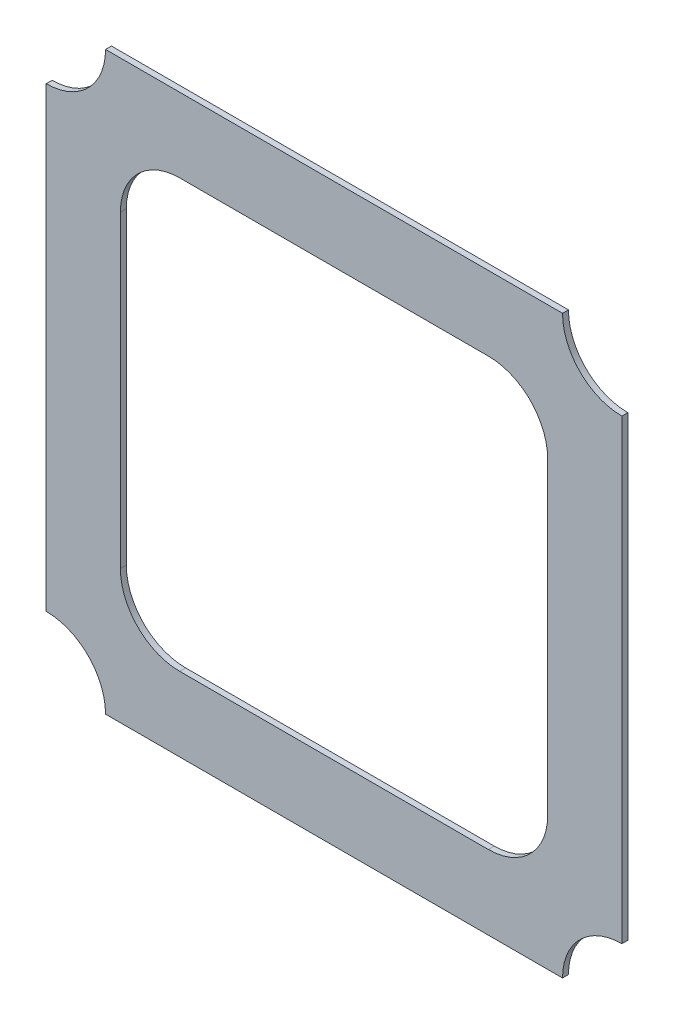
ISO-10303-21;
HEADER;
FILE_DESCRIPTION(('STEP AP214'),'2;1');
FILE_NAME('part.step','',(''),(''),'','','');
FILE_SCHEMA(('AUTOMOTIVE_DESIGN { 1 0 10303 214 1 1 1 1 }'));
ENDSEC;
DATA;
#1=APPLICATION_CONTEXT('core data for automotive mechanical design processes');
#2=APPLICATION_PROTOCOL_DEFINITION('international standard','automotive_design',2000,#1);
#3=PRODUCT_CONTEXT('',#1,'mechanical');
#4=PRODUCT('Part','Part','',(#3));
#5=PRODUCT_RELATED_PRODUCT_CATEGORY('part','',(#4));
#6=PRODUCT_DEFINITION_FORMATION('','',#4);
#7=PRODUCT_DEFINITION_CONTEXT('part definition',#1,'design');
#8=PRODUCT_DEFINITION('design','',#6,#7);
#9=PRODUCT_DEFINITION_SHAPE('','',#8);
#10=(LENGTH_UNIT() NAMED_UNIT(*) SI_UNIT(.MILLI.,.METRE.));
#11=(NAMED_UNIT(*) PLANE_ANGLE_UNIT() SI_UNIT($,.RADIAN.));
#12=(NAMED_UNIT(*) SI_UNIT($,.STERADIAN.) SOLID_ANGLE_UNIT());
#13=UNCERTAINTY_MEASURE_WITH_UNIT(LENGTH_MEASURE(1.E-05),#10,'distance_accuracy_value','');
#14=(GEOMETRIC_REPRESENTATION_CONTEXT(3) GLOBAL_UNCERTAINTY_ASSIGNED_CONTEXT((#13)) GLOBAL_UNIT_ASSIGNED_CONTEXT((#10,
#11,#12)) REPRESENTATION_CONTEXT('',''));
#15=CARTESIAN_POINT('',(0.,0.,0.));
#16=DIRECTION('',(0.,0.,1.));
#17=DIRECTION('',(1.,0.,0.));
#18=AXIS2_PLACEMENT_3D('',#15,#16,#17);
#19=CARTESIAN_POINT('',(48.5,0.,1.));
#20=DIRECTION('',(1.,0.,0.));
#21=DIRECTION('',(0.,1.,0.));
#22=AXIS2_PLACEMENT_3D('',#19,#20,#21);
#23=PLANE('',#22);
#24=DIRECTION('',(0.,0.,1.));
#25=VECTOR('',#24,1.);
#26=CARTESIAN_POINT('',(48.5,-38.5,0.));
#27=LINE('',#26,#25);
#28=CARTESIAN_POINT('',(48.5,-38.5,0.));
#29=VERTEX_POINT('',#28);
#30=CARTESIAN_POINT('',(48.5,-38.5,1.));
#31=VERTEX_POINT('',#30);
#32=EDGE_CURVE('E427',#29,#31,#27,.T.);
#33=ORIENTED_EDGE('',*,*,#32,.F.);
#34=DIRECTION('',(0.,-1.,0.));
#35=VECTOR('',#34,1.);
#36=CARTESIAN_POINT('',(48.5,0.,0.));
#37=LINE('',#36,#35);
#38=CARTESIAN_POINT('',(48.5,38.5,0.));
#39=VERTEX_POINT('',#38);
#40=EDGE_CURVE('E168',#39,#29,#37,.T.);
#41=ORIENTED_EDGE('',*,*,#40,.F.);
#42=DIRECTION('',(0.,0.,1.));
#43=VECTOR('',#42,1.);
#44=CARTESIAN_POINT('',(48.5,38.5,0.));
#45=LINE('',#44,#43);
#46=CARTESIAN_POINT('',(48.5,38.5,1.));
#47=VERTEX_POINT('',#46);
#48=EDGE_CURVE('E153',#39,#47,#45,.T.);
#49=ORIENTED_EDGE('',*,*,#48,.T.);
#50=DIRECTION('',(0.,-1.,0.));
#51=VECTOR('',#50,1.);
#52=CARTESIAN_POINT('',(48.5,0.,1.));
#53=LINE('',#52,#51);
#54=EDGE_CURVE('E165',#47,#31,#53,.T.);
#55=ORIENTED_EDGE('',*,*,#54,.T.);
#56=EDGE_LOOP('',(#33,#41,#49,#55));
#57=FACE_BOUND('',#56,.T.);
#58=ADVANCED_FACE('F36',(#57),#23,.T.);
#59=CARTESIAN_POINT('',(0.,48.5,1.));
#60=DIRECTION('',(0.,1.,0.));
#61=DIRECTION('',(0.,0.,1.));
#62=AXIS2_PLACEMENT_3D('',#59,#60,#61);
#63=PLANE('',#62);
#64=DIRECTION('',(0.,0.,1.));
#65=VECTOR('',#64,1.);
#66=CARTESIAN_POINT('',(38.5,48.5,0.));
#67=LINE('',#66,#65);
#68=CARTESIAN_POINT('',(38.5,48.5,0.));
#69=VERTEX_POINT('',#68);
#70=CARTESIAN_POINT('',(38.5,48.5,1.));
#71=VERTEX_POINT('',#70);
#72=EDGE_CURVE('E154',#69,#71,#67,.T.);
#73=ORIENTED_EDGE('',*,*,#72,.F.);
#74=DIRECTION('',(1.,0.,0.));
#75=VECTOR('',#74,1.);
#76=CARTESIAN_POINT('',(0.,48.5,0.));
#77=LINE('',#76,#75);
#78=CARTESIAN_POINT('',(-38.5,48.5,0.));
#79=VERTEX_POINT('',#78);
#80=EDGE_CURVE('E202',#79,#69,#77,.T.);
#81=ORIENTED_EDGE('',*,*,#80,.F.);
#82=DIRECTION('',(0.,0.,1.));
#83=VECTOR('',#82,1.);
#84=CARTESIAN_POINT('',(-38.5,48.5,0.));
#85=LINE('',#84,#83);
#86=CARTESIAN_POINT('',(-38.5,48.5,1.));
#87=VERTEX_POINT('',#86);
#88=EDGE_CURVE('E169',#79,#87,#85,.T.);
#89=ORIENTED_EDGE('',*,*,#88,.T.);
#90=DIRECTION('',(1.,0.,0.));
#91=VECTOR('',#90,1.);
#92=CARTESIAN_POINT('',(0.,48.5,1.));
#93=LINE('',#92,#91);
#94=EDGE_CURVE('E175',#87,#71,#93,.T.);
#95=ORIENTED_EDGE('',*,*,#94,.T.);
#96=EDGE_LOOP('',(#73,#81,#89,#95));
#97=FACE_BOUND('',#96,.T.);
#98=ADVANCED_FACE('F305',(#97),#63,.T.);
#99=CARTESIAN_POINT('',(-48.5,0.,1.));
#100=DIRECTION('',(1.,0.,0.));
#101=DIRECTION('',(0.,0.,-1.));
#102=AXIS2_PLACEMENT_3D('',#99,#100,#101);
#103=PLANE('',#102);
#104=DIRECTION('',(0.,0.,1.));
#105=VECTOR('',#104,1.);
#106=CARTESIAN_POINT('',(-48.5,-38.5,0.));
#107=LINE('',#106,#105);
#108=CARTESIAN_POINT('',(-48.5,-38.5,0.));
#109=VERTEX_POINT('',#108);
#110=CARTESIAN_POINT('',(-48.5,-38.5,1.));
#111=VERTEX_POINT('',#110);
#112=EDGE_CURVE('E431',#109,#111,#107,.T.);
#113=ORIENTED_EDGE('',*,*,#112,.T.);
#114=DIRECTION('',(0.,-1.,0.));
#115=VECTOR('',#114,1.);
#116=CARTESIAN_POINT('',(-48.5,0.,1.));
#117=LINE('',#116,#115);
#118=CARTESIAN_POINT('',(-48.5,38.5,1.));
#119=VERTEX_POINT('',#118);
#120=EDGE_CURVE('E178',#119,#111,#117,.T.);
#121=ORIENTED_EDGE('',*,*,#120,.F.);
#122=DIRECTION('',(0.,0.,1.));
#123=VECTOR('',#122,1.);
#124=CARTESIAN_POINT('',(-48.5,38.5,0.));
#125=LINE('',#124,#123);
#126=CARTESIAN_POINT('',(-48.5,38.5,0.));
#127=VERTEX_POINT('',#126);
#128=EDGE_CURVE('E203',#127,#119,#125,.T.);
#129=ORIENTED_EDGE('',*,*,#128,.F.);
#130=DIRECTION('',(0.,-1.,0.));
#131=VECTOR('',#130,1.);
#132=CARTESIAN_POINT('',(-48.5,0.,0.));
#133=LINE('',#132,#131);
#134=EDGE_CURVE('E206',#127,#109,#133,.T.);
#135=ORIENTED_EDGE('',*,*,#134,.T.);
#136=EDGE_LOOP('',(#113,#121,#129,#135));
#137=FACE_BOUND('',#136,.T.);
#138=ADVANCED_FACE('F309',(#137),#103,.F.);
#139=CARTESIAN_POINT('',(0.,-48.5,1.));
#140=DIRECTION('',(0.,1.,0.));
#141=DIRECTION('',(0.,0.,1.));
#142=AXIS2_PLACEMENT_3D('',#139,#140,#141);
#143=PLANE('',#142);
#144=DIRECTION('',(1.,0.,0.));
#145=VECTOR('',#144,1.);
#146=CARTESIAN_POINT('',(0.,-48.5,1.));
#147=LINE('',#146,#145);
#148=CARTESIAN_POINT('',(-38.5,-48.5,1.));
#149=VERTEX_POINT('',#148);
#150=CARTESIAN_POINT('',(38.5,-48.5,1.));
#151=VERTEX_POINT('',#150);
#152=EDGE_CURVE('E187',#149,#151,#147,.T.);
#153=ORIENTED_EDGE('',*,*,#152,.F.);
#154=DIRECTION('',(0.,0.,1.));
#155=VECTOR('',#154,1.);
#156=CARTESIAN_POINT('',(-38.5,-48.5,0.));
#157=LINE('',#156,#155);
#158=CARTESIAN_POINT('',(-38.5,-48.5,0.));
#159=VERTEX_POINT('',#158);
#160=EDGE_CURVE('E432',#159,#149,#157,.T.);
#161=ORIENTED_EDGE('',*,*,#160,.F.);
#162=DIRECTION('',(1.,0.,0.));
#163=VECTOR('',#162,1.);
#164=CARTESIAN_POINT('',(0.,-48.5,0.));
#165=LINE('',#164,#163);
#166=CARTESIAN_POINT('',(38.5,-48.5,0.));
#167=VERTEX_POINT('',#166);
#168=EDGE_CURVE('E209',#159,#167,#165,.T.);
#169=ORIENTED_EDGE('',*,*,#168,.T.);
#170=DIRECTION('',(0.,0.,1.));
#171=VECTOR('',#170,1.);
#172=CARTESIAN_POINT('',(38.5,-48.5,0.));
#173=LINE('',#172,#171);
#174=EDGE_CURVE('E424',#167,#151,#173,.T.);
#175=ORIENTED_EDGE('',*,*,#174,.T.);
#176=EDGE_LOOP('',(#153,#161,#169,#175));
#177=FACE_BOUND('',#176,.T.);
#178=ADVANCED_FACE('F315',(#177),#143,.F.);
#179=CARTESIAN_POINT('',(0.,0.,1.));
#180=DIRECTION('',(0.,0.,1.));
#181=DIRECTION('',(1.,0.,0.));
#182=AXIS2_PLACEMENT_3D('',#179,#180,#181);
#183=PLANE('',#182);
#184=DIRECTION('',(0.,-1.,0.));
#185=VECTOR('',#184,1.);
#186=CARTESIAN_POINT('',(-36.,0.,1.));
#187=LINE('',#186,#185);
#188=CARTESIAN_POINT('',(-36.,26.,1.));
#189=VERTEX_POINT('',#188);
#190=CARTESIAN_POINT('',(-36.,-26.,1.));
#191=VERTEX_POINT('',#190);
#192=EDGE_CURVE('E197',#189,#191,#187,.T.);
#193=ORIENTED_EDGE('',*,*,#192,.F.);
#194=CARTESIAN_POINT('',(-26.,26.,1.));
#195=DIRECTION('',(0.,0.,1.));
#196=DIRECTION('',(1.,0.,0.));
#197=AXIS2_PLACEMENT_3D('',#194,#195,#196);
#198=CIRCLE('',#197,10.);
#199=CARTESIAN_POINT('',(-26.,36.,1.));
#200=VERTEX_POINT('',#199);
#201=EDGE_CURVE('E11',#189,#200,#198,.F.);
#202=ORIENTED_EDGE('',*,*,#201,.T.);
#203=DIRECTION('',(1.,0.,0.));
#204=VECTOR('',#203,1.);
#205=CARTESIAN_POINT('',(0.,36.,1.));
#206=LINE('',#205,#204);
#207=CARTESIAN_POINT('',(26.,36.,1.));
#208=VERTEX_POINT('',#207);
#209=EDGE_CURVE('E189',#200,#208,#206,.T.);
#210=ORIENTED_EDGE('',*,*,#209,.T.);
#211=CARTESIAN_POINT('',(26.,26.,1.));
#212=DIRECTION('',(0.,0.,1.));
#213=DIRECTION('',(1.,0.,0.));
#214=AXIS2_PLACEMENT_3D('',#211,#212,#213);
#215=CIRCLE('',#214,10.);
#216=CARTESIAN_POINT('',(36.,26.,1.));
#217=VERTEX_POINT('',#216);
#218=EDGE_CURVE('E254',#208,#217,#215,.F.);
#219=ORIENTED_EDGE('',*,*,#218,.T.);
#220=DIRECTION('',(0.,-1.,0.));
#221=VECTOR('',#220,1.);
#222=CARTESIAN_POINT('',(36.,0.,1.));
#223=LINE('',#222,#221);
#224=CARTESIAN_POINT('',(36.,-26.,1.));
#225=VERTEX_POINT('',#224);
#226=EDGE_CURVE('E191',#217,#225,#223,.T.);
#227=ORIENTED_EDGE('',*,*,#226,.T.);
#228=CARTESIAN_POINT('',(26.,-26.,1.));
#229=DIRECTION('',(0.,0.,1.));
#230=DIRECTION('',(1.,0.,0.));
#231=AXIS2_PLACEMENT_3D('',#228,#229,#230);
#232=CIRCLE('',#231,10.);
#233=CARTESIAN_POINT('',(26.,-36.,1.));
#234=VERTEX_POINT('',#233);
#235=EDGE_CURVE('E160',#225,#234,#232,.F.);
#236=ORIENTED_EDGE('',*,*,#235,.T.);
#237=DIRECTION('',(1.,0.,0.));
#238=VECTOR('',#237,1.);
#239=CARTESIAN_POINT('',(0.,-36.,1.));
#240=LINE('',#239,#238);
#241=CARTESIAN_POINT('',(-26.,-36.,1.));
#242=VERTEX_POINT('',#241);
#243=EDGE_CURVE('E194',#242,#234,#240,.T.);
#244=ORIENTED_EDGE('',*,*,#243,.F.);
#245=CARTESIAN_POINT('',(-26.,-26.,1.));
#246=DIRECTION('',(0.,0.,1.));
#247=DIRECTION('',(1.,0.,0.));
#248=AXIS2_PLACEMENT_3D('',#245,#246,#247);
#249=CIRCLE('',#248,10.);
#250=EDGE_CURVE('E239',#242,#191,#249,.F.);
#251=ORIENTED_EDGE('',*,*,#250,.T.);
#252=EDGE_LOOP('',(#193,#202,#210,#219,#227,#236,#244,#251));
#253=FACE_BOUND('',#252,.T.);
#254=ORIENTED_EDGE('',*,*,#120,.T.);
#255=CARTESIAN_POINT('',(-48.5,-48.5,1.));
#256=DIRECTION('',(0.,0.,1.));
#257=DIRECTION('',(1.,0.,0.));
#258=AXIS2_PLACEMENT_3D('',#255,#256,#257);
#259=CIRCLE('',#258,10.);
#260=EDGE_CURVE('E241',#111,#149,#259,.F.);
#261=ORIENTED_EDGE('',*,*,#260,.T.);
#262=ORIENTED_EDGE('',*,*,#152,.T.);
#263=CARTESIAN_POINT('',(48.5,-48.5,1.));
#264=DIRECTION('',(0.,0.,1.));
#265=DIRECTION('',(1.,0.,0.));
#266=AXIS2_PLACEMENT_3D('',#263,#264,#265);
#267=CIRCLE('',#266,10.);
#268=EDGE_CURVE('E174',#151,#31,#267,.F.);
#269=ORIENTED_EDGE('',*,*,#268,.T.);
#270=ORIENTED_EDGE('',*,*,#54,.F.);
#271=CARTESIAN_POINT('',(48.5,48.5,1.));
#272=DIRECTION('',(0.,0.,1.));
#273=DIRECTION('',(1.,0.,0.));
#274=AXIS2_PLACEMENT_3D('',#271,#272,#273);
#275=CIRCLE('',#274,10.);
#276=EDGE_CURVE('E149',#47,#71,#275,.F.);
#277=ORIENTED_EDGE('',*,*,#276,.T.);
#278=ORIENTED_EDGE('',*,*,#94,.F.);
#279=CARTESIAN_POINT('',(-48.5,48.5,1.));
#280=DIRECTION('',(0.,0.,1.));
#281=DIRECTION('',(1.,0.,0.));
#282=AXIS2_PLACEMENT_3D('',#279,#280,#281);
#283=CIRCLE('',#282,10.);
#284=EDGE_CURVE('E256',#87,#119,#283,.F.);
#285=ORIENTED_EDGE('',*,*,#284,.T.);
#286=EDGE_LOOP('',(#254,#261,#262,#269,#270,#277,#278,#285));
#287=FACE_BOUND('',#286,.T.);
#288=ADVANCED_FACE('F172',(#253,#287),#183,.T.);
#289=CARTESIAN_POINT('',(0.,0.,0.));
#290=DIRECTION('',(0.,0.,1.));
#291=DIRECTION('',(1.,0.,0.));
#292=AXIS2_PLACEMENT_3D('',#289,#290,#291);
#293=PLANE('',#292);
#294=DIRECTION('',(1.,0.,0.));
#295=VECTOR('',#294,1.);
#296=CARTESIAN_POINT('',(0.,36.,0.));
#297=LINE('',#296,#295);
#298=CARTESIAN_POINT('',(-26.,36.,0.));
#299=VERTEX_POINT('',#298);
#300=CARTESIAN_POINT('',(26.,36.,0.));
#301=VERTEX_POINT('',#300);
#302=EDGE_CURVE('E212',#299,#301,#297,.T.);
#303=ORIENTED_EDGE('',*,*,#302,.F.);
#304=CARTESIAN_POINT('',(-26.,26.,0.));
#305=DIRECTION('',(0.,0.,1.));
#306=DIRECTION('',(1.,0.,0.));
#307=AXIS2_PLACEMENT_3D('',#304,#305,#306);
#308=CIRCLE('',#307,10.);
#309=CARTESIAN_POINT('',(-36.,26.,0.));
#310=VERTEX_POINT('',#309);
#311=EDGE_CURVE('E44',#299,#310,#308,.T.);
#312=ORIENTED_EDGE('',*,*,#311,.T.);
#313=DIRECTION('',(0.,-1.,0.));
#314=VECTOR('',#313,1.);
#315=CARTESIAN_POINT('',(-36.,0.,0.));
#316=LINE('',#315,#314);
#317=CARTESIAN_POINT('',(-36.,-26.,0.));
#318=VERTEX_POINT('',#317);
#319=EDGE_CURVE('E176',#310,#318,#316,.T.);
#320=ORIENTED_EDGE('',*,*,#319,.T.);
#321=CARTESIAN_POINT('',(-26.,-26.,0.));
#322=DIRECTION('',(0.,0.,1.));
#323=DIRECTION('',(1.,0.,0.));
#324=AXIS2_PLACEMENT_3D('',#321,#322,#323);
#325=CIRCLE('',#324,10.);
#326=CARTESIAN_POINT('',(-26.,-36.,0.));
#327=VERTEX_POINT('',#326);
#328=EDGE_CURVE('E237',#318,#327,#325,.T.);
#329=ORIENTED_EDGE('',*,*,#328,.T.);
#330=DIRECTION('',(1.,0.,0.));
#331=VECTOR('',#330,1.);
#332=CARTESIAN_POINT('',(0.,-36.,0.));
#333=LINE('',#332,#331);
#334=CARTESIAN_POINT('',(26.,-36.,0.));
#335=VERTEX_POINT('',#334);
#336=EDGE_CURVE('E181',#327,#335,#333,.T.);
#337=ORIENTED_EDGE('',*,*,#336,.T.);
#338=CARTESIAN_POINT('',(26.,-26.,0.));
#339=DIRECTION('',(0.,0.,1.));
#340=DIRECTION('',(1.,0.,0.));
#341=AXIS2_PLACEMENT_3D('',#338,#339,#340);
#342=CIRCLE('',#341,10.);
#343=CARTESIAN_POINT('',(36.,-26.,0.));
#344=VERTEX_POINT('',#343);
#345=EDGE_CURVE('E248',#335,#344,#342,.T.);
#346=ORIENTED_EDGE('',*,*,#345,.T.);
#347=DIRECTION('',(0.,-1.,0.));
#348=VECTOR('',#347,1.);
#349=CARTESIAN_POINT('',(36.,0.,0.));
#350=LINE('',#349,#348);
#351=CARTESIAN_POINT('',(36.,26.,0.));
#352=VERTEX_POINT('',#351);
#353=EDGE_CURVE('E214',#352,#344,#350,.T.);
#354=ORIENTED_EDGE('',*,*,#353,.F.);
#355=CARTESIAN_POINT('',(26.,26.,0.));
#356=DIRECTION('',(0.,0.,1.));
#357=DIRECTION('',(1.,0.,0.));
#358=AXIS2_PLACEMENT_3D('',#355,#356,#357);
#359=CIRCLE('',#358,10.);
#360=EDGE_CURVE('E252',#352,#301,#359,.T.);
#361=ORIENTED_EDGE('',*,*,#360,.T.);
#362=EDGE_LOOP('',(#303,#312,#320,#329,#337,#346,#354,#361));
#363=FACE_BOUND('',#362,.T.);
#364=ORIENTED_EDGE('',*,*,#168,.F.);
#365=CARTESIAN_POINT('',(-48.5,-48.5,0.));
#366=DIRECTION('',(0.,0.,1.));
#367=DIRECTION('',(1.,0.,0.));
#368=AXIS2_PLACEMENT_3D('',#365,#366,#367);
#369=CIRCLE('',#368,10.);
#370=EDGE_CURVE('E243',#159,#109,#369,.T.);
#371=ORIENTED_EDGE('',*,*,#370,.T.);
#372=ORIENTED_EDGE('',*,*,#134,.F.);
#373=CARTESIAN_POINT('',(-48.5,48.5,0.));
#374=DIRECTION('',(0.,0.,1.));
#375=DIRECTION('',(1.,0.,0.));
#376=AXIS2_PLACEMENT_3D('',#373,#374,#375);
#377=CIRCLE('',#376,10.);
#378=EDGE_CURVE('E258',#127,#79,#377,.T.);
#379=ORIENTED_EDGE('',*,*,#378,.T.);
#380=ORIENTED_EDGE('',*,*,#80,.T.);
#381=CARTESIAN_POINT('',(48.5,48.5,0.));
#382=DIRECTION('',(0.,0.,1.));
#383=DIRECTION('',(1.,0.,0.));
#384=AXIS2_PLACEMENT_3D('',#381,#382,#383);
#385=CIRCLE('',#384,10.);
#386=EDGE_CURVE('E159',#69,#39,#385,.T.);
#387=ORIENTED_EDGE('',*,*,#386,.T.);
#388=ORIENTED_EDGE('',*,*,#40,.T.);
#389=CARTESIAN_POINT('',(48.5,-48.5,0.));
#390=DIRECTION('',(0.,0.,1.));
#391=DIRECTION('',(1.,0.,0.));
#392=AXIS2_PLACEMENT_3D('',#389,#390,#391);
#393=CIRCLE('',#392,10.);
#394=EDGE_CURVE('E246',#29,#167,#393,.T.);
#395=ORIENTED_EDGE('',*,*,#394,.T.);
#396=EDGE_LOOP('',(#364,#371,#372,#379,#380,#387,#388,#395));
#397=FACE_BOUND('',#396,.T.);
#398=ADVANCED_FACE('F262',(#363,#397),#293,.F.);
#399=CARTESIAN_POINT('',(0.,36.,1.));
#400=DIRECTION('',(0.,1.,0.));
#401=DIRECTION('',(0.,0.,1.));
#402=AXIS2_PLACEMENT_3D('',#399,#400,#401);
#403=PLANE('',#402);
#404=ORIENTED_EDGE('',*,*,#302,.T.);
#405=DIRECTION('',(0.,0.,-1.));
#406=VECTOR('',#405,1.);
#407=CARTESIAN_POINT('',(26.,36.,1.));
#408=LINE('',#407,#406);
#409=EDGE_CURVE('E51',#301,#208,#408,.F.);
#410=ORIENTED_EDGE('',*,*,#409,.T.);
#411=ORIENTED_EDGE('',*,*,#209,.F.);
#412=DIRECTION('',(0.,0.,-1.));
#413=VECTOR('',#412,1.);
#414=CARTESIAN_POINT('',(-26.,36.,1.));
#415=LINE('',#414,#413);
#416=EDGE_CURVE('E233',#200,#299,#415,.T.);
#417=ORIENTED_EDGE('',*,*,#416,.T.);
#418=EDGE_LOOP('',(#404,#410,#411,#417));
#419=FACE_BOUND('',#418,.T.);
#420=ADVANCED_FACE('F270',(#419),#403,.F.);
#421=CARTESIAN_POINT('',(36.,0.,1.));
#422=DIRECTION('',(1.,0.,0.));
#423=DIRECTION('',(0.,0.,-1.));
#424=AXIS2_PLACEMENT_3D('',#421,#422,#423);
#425=PLANE('',#424);
#426=ORIENTED_EDGE('',*,*,#353,.T.);
#427=DIRECTION('',(0.,0.,-1.));
#428=VECTOR('',#427,1.);
#429=CARTESIAN_POINT('',(36.,-26.,1.));
#430=LINE('',#429,#428);
#431=EDGE_CURVE('E231',#344,#225,#430,.F.);
#432=ORIENTED_EDGE('',*,*,#431,.T.);
#433=ORIENTED_EDGE('',*,*,#226,.F.);
#434=DIRECTION('',(0.,0.,-1.));
#435=VECTOR('',#434,1.);
#436=CARTESIAN_POINT('',(36.,26.,0.));
#437=LINE('',#436,#435);
#438=EDGE_CURVE('E228',#217,#352,#437,.T.);
#439=ORIENTED_EDGE('',*,*,#438,.T.);
#440=EDGE_LOOP('',(#426,#432,#433,#439));
#441=FACE_BOUND('',#440,.T.);
#442=ADVANCED_FACE('F278',(#441),#425,.F.);
#443=CARTESIAN_POINT('',(0.,-36.,1.));
#444=DIRECTION('',(0.,1.,0.));
#445=DIRECTION('',(0.,0.,1.));
#446=AXIS2_PLACEMENT_3D('',#443,#444,#445);
#447=PLANE('',#446);
#448=ORIENTED_EDGE('',*,*,#336,.F.);
#449=DIRECTION('',(0.,0.,-1.));
#450=VECTOR('',#449,1.);
#451=CARTESIAN_POINT('',(-26.,-36.,1.));
#452=LINE('',#451,#450);
#453=EDGE_CURVE('E226',#327,#242,#452,.F.);
#454=ORIENTED_EDGE('',*,*,#453,.T.);
#455=ORIENTED_EDGE('',*,*,#243,.T.);
#456=DIRECTION('',(0.,0.,-1.));
#457=VECTOR('',#456,1.);
#458=CARTESIAN_POINT('',(26.,-36.,1.));
#459=LINE('',#458,#457);
#460=EDGE_CURVE('E223',#234,#335,#459,.T.);
#461=ORIENTED_EDGE('',*,*,#460,.T.);
#462=EDGE_LOOP('',(#448,#454,#455,#461));
#463=FACE_BOUND('',#462,.T.);
#464=ADVANCED_FACE('F286',(#463),#447,.T.);
#465=CARTESIAN_POINT('',(-36.,0.,1.));
#466=DIRECTION('',(1.,0.,0.));
#467=DIRECTION('',(0.,1.,0.));
#468=AXIS2_PLACEMENT_3D('',#465,#466,#467);
#469=PLANE('',#468);
#470=ORIENTED_EDGE('',*,*,#192,.T.);
#471=DIRECTION('',(0.,0.,-1.));
#472=VECTOR('',#471,1.);
#473=CARTESIAN_POINT('',(-36.,-26.,0.));
#474=LINE('',#473,#472);
#475=EDGE_CURVE('E220',#191,#318,#474,.T.);
#476=ORIENTED_EDGE('',*,*,#475,.T.);
#477=ORIENTED_EDGE('',*,*,#319,.F.);
#478=DIRECTION('',(0.,0.,-1.));
#479=VECTOR('',#478,1.);
#480=CARTESIAN_POINT('',(-36.,26.,1.));
#481=LINE('',#480,#479);
#482=EDGE_CURVE('E200',#310,#189,#481,.F.);
#483=ORIENTED_EDGE('',*,*,#482,.T.);
#484=EDGE_LOOP('',(#470,#476,#477,#483));
#485=FACE_BOUND('',#484,.T.);
#486=ADVANCED_FACE('F268',(#485),#469,.T.);
#487=CARTESIAN_POINT('',(-26.,-26.,1.));
#488=DIRECTION('',(0.,0.,1.));
#489=DIRECTION('',(1.,0.,0.));
#490=AXIS2_PLACEMENT_3D('',#487,#488,#489);
#491=CYLINDRICAL_SURFACE('',#490,10.);
#492=ORIENTED_EDGE('',*,*,#250,.F.);
#493=ORIENTED_EDGE('',*,*,#453,.F.);
#494=ORIENTED_EDGE('',*,*,#328,.F.);
#495=ORIENTED_EDGE('',*,*,#475,.F.);
#496=EDGE_LOOP('',(#492,#493,#494,#495));
#497=FACE_BOUND('',#496,.T.);
#498=ADVANCED_FACE('F291',(#497),#491,.F.);
#499=CARTESIAN_POINT('',(-48.5,-48.5,0.));
#500=DIRECTION('',(0.,0.,1.));
#501=DIRECTION('',(1.,0.,0.));
#502=AXIS2_PLACEMENT_3D('',#499,#500,#501);
#503=CYLINDRICAL_SURFACE('',#502,10.);
#504=ORIENTED_EDGE('',*,*,#370,.F.);
#505=ORIENTED_EDGE('',*,*,#160,.T.);
#506=ORIENTED_EDGE('',*,*,#260,.F.);
#507=ORIENTED_EDGE('',*,*,#112,.F.);
#508=EDGE_LOOP('',(#504,#505,#506,#507));
#509=FACE_BOUND('',#508,.T.);
#510=ADVANCED_FACE('F293',(#509),#503,.F.);
#511=CARTESIAN_POINT('',(48.5,-48.5,0.));
#512=DIRECTION('',(0.,0.,1.));
#513=DIRECTION('',(1.,0.,0.));
#514=AXIS2_PLACEMENT_3D('',#511,#512,#513);
#515=CYLINDRICAL_SURFACE('',#514,10.);
#516=ORIENTED_EDGE('',*,*,#394,.F.);
#517=ORIENTED_EDGE('',*,*,#32,.T.);
#518=ORIENTED_EDGE('',*,*,#268,.F.);
#519=ORIENTED_EDGE('',*,*,#174,.F.);
#520=EDGE_LOOP('',(#516,#517,#518,#519));
#521=FACE_BOUND('',#520,.T.);
#522=ADVANCED_FACE('F299',(#521),#515,.F.);
#523=CARTESIAN_POINT('',(26.,-26.,1.));
#524=DIRECTION('',(0.,0.,-1.));
#525=DIRECTION('',(-1.,0.,0.));
#526=AXIS2_PLACEMENT_3D('',#523,#524,#525);
#527=CYLINDRICAL_SURFACE('',#526,10.);
#528=ORIENTED_EDGE('',*,*,#235,.F.);
#529=ORIENTED_EDGE('',*,*,#431,.F.);
#530=ORIENTED_EDGE('',*,*,#345,.F.);
#531=ORIENTED_EDGE('',*,*,#460,.F.);
#532=EDGE_LOOP('',(#528,#529,#530,#531));
#533=FACE_BOUND('',#532,.T.);
#534=ADVANCED_FACE('F284',(#533),#527,.F.);
#535=CARTESIAN_POINT('',(48.5,48.5,0.));
#536=DIRECTION('',(0.,0.,1.));
#537=DIRECTION('',(1.,0.,0.));
#538=AXIS2_PLACEMENT_3D('',#535,#536,#537);
#539=CYLINDRICAL_SURFACE('',#538,10.);
#540=ORIENTED_EDGE('',*,*,#386,.F.);
#541=ORIENTED_EDGE('',*,*,#72,.T.);
#542=ORIENTED_EDGE('',*,*,#276,.F.);
#543=ORIENTED_EDGE('',*,*,#48,.F.);
#544=EDGE_LOOP('',(#540,#541,#542,#543));
#545=FACE_BOUND('',#544,.T.);
#546=ADVANCED_FACE('F152',(#545),#539,.F.);
#547=CARTESIAN_POINT('',(26.,26.,1.));
#548=DIRECTION('',(0.,0.,1.));
#549=DIRECTION('',(1.,0.,0.));
#550=AXIS2_PLACEMENT_3D('',#547,#548,#549);
#551=CYLINDRICAL_SURFACE('',#550,10.);
#552=ORIENTED_EDGE('',*,*,#218,.F.);
#553=ORIENTED_EDGE('',*,*,#409,.F.);
#554=ORIENTED_EDGE('',*,*,#360,.F.);
#555=ORIENTED_EDGE('',*,*,#438,.F.);
#556=EDGE_LOOP('',(#552,#553,#554,#555));
#557=FACE_BOUND('',#556,.T.);
#558=ADVANCED_FACE('F275',(#557),#551,.F.);
#559=CARTESIAN_POINT('',(-48.5,48.5,0.));
#560=DIRECTION('',(0.,0.,1.));
#561=DIRECTION('',(1.,0.,0.));
#562=AXIS2_PLACEMENT_3D('',#559,#560,#561);
#563=CYLINDRICAL_SURFACE('',#562,10.);
#564=ORIENTED_EDGE('',*,*,#378,.F.);
#565=ORIENTED_EDGE('',*,*,#128,.T.);
#566=ORIENTED_EDGE('',*,*,#284,.F.);
#567=ORIENTED_EDGE('',*,*,#88,.F.);
#568=EDGE_LOOP('',(#564,#565,#566,#567));
#569=FACE_BOUND('',#568,.T.);
#570=ADVANCED_FACE('F398',(#569),#563,.F.);
#571=CARTESIAN_POINT('',(-26.,26.,1.));
#572=DIRECTION('',(0.,0.,-1.));
#573=DIRECTION('',(-1.,0.,0.));
#574=AXIS2_PLACEMENT_3D('',#571,#572,#573);
#575=CYLINDRICAL_SURFACE('',#574,10.);
#576=ORIENTED_EDGE('',*,*,#201,.F.);
#577=ORIENTED_EDGE('',*,*,#482,.F.);
#578=ORIENTED_EDGE('',*,*,#311,.F.);
#579=ORIENTED_EDGE('',*,*,#416,.F.);
#580=EDGE_LOOP('',(#576,#577,#578,#579));
#581=FACE_BOUND('',#580,.T.);
#582=ADVANCED_FACE('F38',(#581),#575,.F.);
#583=CLOSED_SHELL('',(#58,#98,#138,#178,#288,#398,#420,#442,#464,#486,#498,#510,#522,#534,#546,
#558,#570,#582));
#584=MANIFOLD_SOLID_BREP('B2',#583);
#585=ADVANCED_BREP_SHAPE_REPRESENTATION('',(#18,#584),#14);
#586=SHAPE_DEFINITION_REPRESENTATION(#9,#585);
ENDSEC;
END-ISO-10303-21;
